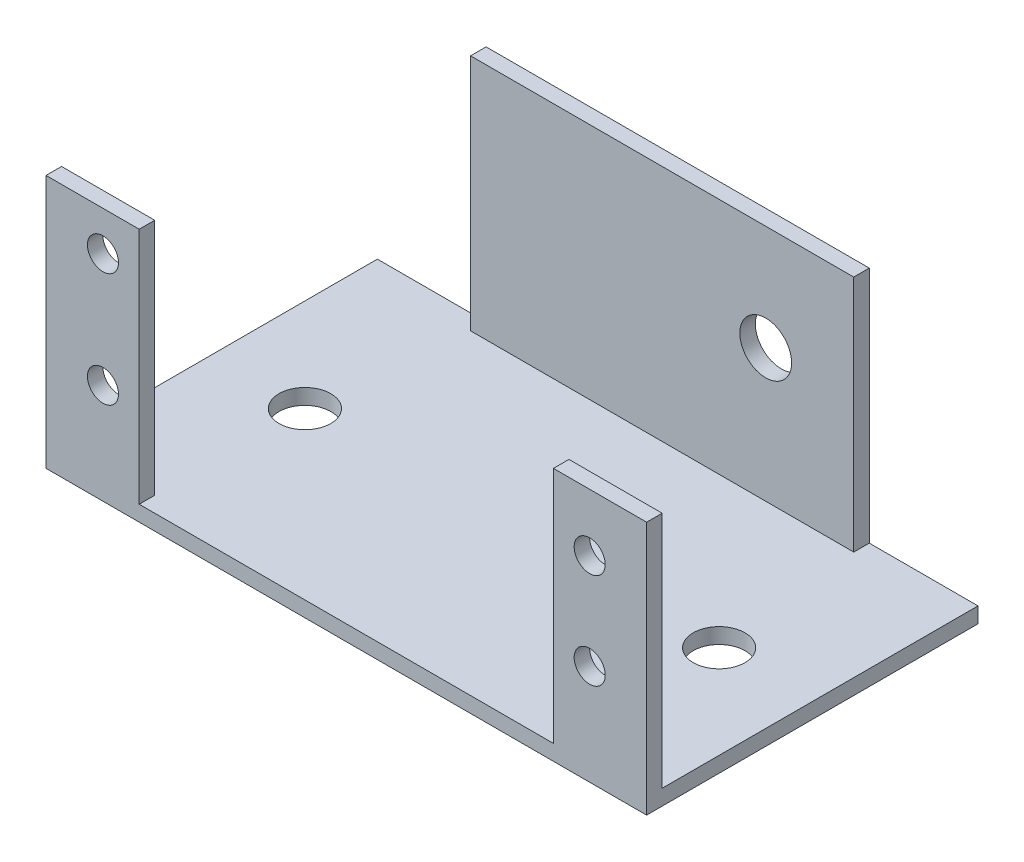
ISO-10303-21;
HEADER;
FILE_DESCRIPTION(('STEP AP214'),'2;1');
FILE_NAME('part.step','',(''),(''),'','','');
FILE_SCHEMA(('AUTOMOTIVE_DESIGN { 1 0 10303 214 1 1 1 1 }'));
ENDSEC;
DATA;
#1=APPLICATION_CONTEXT('core data for automotive mechanical design processes');
#2=APPLICATION_PROTOCOL_DEFINITION('international standard','automotive_design',2000,#1);
#3=PRODUCT_CONTEXT('',#1,'mechanical');
#4=PRODUCT('Part','Part','',(#3));
#5=PRODUCT_RELATED_PRODUCT_CATEGORY('part','',(#4));
#6=PRODUCT_DEFINITION_FORMATION('','',#4);
#7=PRODUCT_DEFINITION_CONTEXT('part definition',#1,'design');
#8=PRODUCT_DEFINITION('design','',#6,#7);
#9=PRODUCT_DEFINITION_SHAPE('','',#8);
#10=(LENGTH_UNIT() NAMED_UNIT(*) SI_UNIT(.MILLI.,.METRE.));
#11=(NAMED_UNIT(*) PLANE_ANGLE_UNIT() SI_UNIT($,.RADIAN.));
#12=(NAMED_UNIT(*) SI_UNIT($,.STERADIAN.) SOLID_ANGLE_UNIT());
#13=UNCERTAINTY_MEASURE_WITH_UNIT(LENGTH_MEASURE(1.E-05),#10,'distance_accuracy_value','');
#14=(GEOMETRIC_REPRESENTATION_CONTEXT(3) GLOBAL_UNCERTAINTY_ASSIGNED_CONTEXT((#13)) GLOBAL_UNIT_ASSIGNED_CONTEXT((#10,
#11,#12)) REPRESENTATION_CONTEXT('',''));
#15=CARTESIAN_POINT('',(0.,0.,0.));
#16=DIRECTION('',(0.,0.,1.));
#17=DIRECTION('',(1.,0.,0.));
#18=AXIS2_PLACEMENT_3D('',#15,#16,#17);
#19=CARTESIAN_POINT('',(0.,0.,0.));
#20=DIRECTION('',(0.,1.,0.));
#21=DIRECTION('',(0.,0.,1.));
#22=AXIS2_PLACEMENT_3D('',#19,#20,#21);
#23=PLANE('',#22);
#24=CARTESIAN_POINT('',(20.,0.,0.));
#25=DIRECTION('',(0.,1.,0.));
#26=DIRECTION('',(0.,0.,1.));
#27=AXIS2_PLACEMENT_3D('',#24,#25,#26);
#28=CIRCLE('',#27,2.5);
#29=CARTESIAN_POINT('',(20.,0.,2.5));
#30=VERTEX_POINT('',#29);
#31=EDGE_CURVE('E303',#30,#30,#28,.T.);
#32=ORIENTED_EDGE('',*,*,#31,.F.);
#33=EDGE_LOOP('',(#32));
#34=FACE_BOUND('',#33,.T.);
#35=CARTESIAN_POINT('',(-20.,0.,0.));
#36=DIRECTION('',(0.,1.,0.));
#37=DIRECTION('',(0.,0.,1.));
#38=AXIS2_PLACEMENT_3D('',#35,#36,#37);
#39=CIRCLE('',#38,2.5);
#40=CARTESIAN_POINT('',(-20.,0.,2.5));
#41=VERTEX_POINT('',#40);
#42=EDGE_CURVE('E309',#41,#41,#39,.T.);
#43=ORIENTED_EDGE('',*,*,#42,.F.);
#44=EDGE_LOOP('',(#43));
#45=FACE_BOUND('',#44,.T.);
#46=DIRECTION('',(-1.,0.,0.));
#47=VECTOR('',#46,1.);
#48=CARTESIAN_POINT('',(0.,0.,-14.5));
#49=LINE('',#48,#47);
#50=CARTESIAN_POINT('',(18.5,0.,-14.5));
#51=VERTEX_POINT('',#50);
#52=CARTESIAN_POINT('',(-18.5,0.,-14.5));
#53=VERTEX_POINT('',#52);
#54=EDGE_CURVE('E88',#51,#53,#49,.T.);
#55=ORIENTED_EDGE('',*,*,#54,.T.);
#56=DIRECTION('',(0.,0.,1.));
#57=VECTOR('',#56,1.);
#58=CARTESIAN_POINT('',(-18.5,0.,0.));
#59=LINE('',#58,#57);
#60=CARTESIAN_POINT('',(-18.5,0.,-16.));
#61=VERTEX_POINT('',#60);
#62=EDGE_CURVE('E319',#61,#53,#59,.T.);
#63=ORIENTED_EDGE('',*,*,#62,.F.);
#64=DIRECTION('',(-1.,0.,0.));
#65=VECTOR('',#64,1.);
#66=CARTESIAN_POINT('',(0.,0.,-16.));
#67=LINE('',#66,#65);
#68=CARTESIAN_POINT('',(-29.,0.,-16.));
#69=VERTEX_POINT('',#68);
#70=EDGE_CURVE('E197',#61,#69,#67,.T.);
#71=ORIENTED_EDGE('',*,*,#70,.T.);
#72=DIRECTION('',(0.,0.,1.));
#73=VECTOR('',#72,1.);
#74=CARTESIAN_POINT('',(-29.,0.,0.));
#75=LINE('',#74,#73);
#76=CARTESIAN_POINT('',(-29.,0.,14.5));
#77=VERTEX_POINT('',#76);
#78=EDGE_CURVE('E285',#69,#77,#75,.T.);
#79=ORIENTED_EDGE('',*,*,#78,.T.);
#80=DIRECTION('',(1.,0.,0.));
#81=VECTOR('',#80,1.);
#82=CARTESIAN_POINT('',(0.,0.,14.5));
#83=LINE('',#82,#81);
#84=CARTESIAN_POINT('',(-20.,0.,14.5));
#85=VERTEX_POINT('',#84);
#86=EDGE_CURVE('E245',#77,#85,#83,.T.);
#87=ORIENTED_EDGE('',*,*,#86,.T.);
#88=DIRECTION('',(0.,0.,1.));
#89=VECTOR('',#88,1.);
#90=CARTESIAN_POINT('',(-20.,0.,0.));
#91=LINE('',#90,#89);
#92=CARTESIAN_POINT('',(-20.,0.,16.));
#93=VERTEX_POINT('',#92);
#94=EDGE_CURVE('E240',#85,#93,#91,.T.);
#95=ORIENTED_EDGE('',*,*,#94,.T.);
#96=DIRECTION('',(-1.,0.,0.));
#97=VECTOR('',#96,1.);
#98=CARTESIAN_POINT('',(0.,0.,16.));
#99=LINE('',#98,#97);
#100=CARTESIAN_POINT('',(20.,0.,16.));
#101=VERTEX_POINT('',#100);
#102=EDGE_CURVE('E271',#101,#93,#99,.T.);
#103=ORIENTED_EDGE('',*,*,#102,.F.);
#104=DIRECTION('',(0.,0.,1.));
#105=VECTOR('',#104,1.);
#106=CARTESIAN_POINT('',(20.,0.,0.));
#107=LINE('',#106,#105);
#108=CARTESIAN_POINT('',(20.,0.,14.5));
#109=VERTEX_POINT('',#108);
#110=EDGE_CURVE('E220',#109,#101,#107,.T.);
#111=ORIENTED_EDGE('',*,*,#110,.F.);
#112=DIRECTION('',(1.,0.,0.));
#113=VECTOR('',#112,1.);
#114=CARTESIAN_POINT('',(0.,0.,14.5));
#115=LINE('',#114,#113);
#116=CARTESIAN_POINT('',(29.,0.,14.5));
#117=VERTEX_POINT('',#116);
#118=EDGE_CURVE('E229',#109,#117,#115,.T.);
#119=ORIENTED_EDGE('',*,*,#118,.T.);
#120=DIRECTION('',(0.,0.,1.));
#121=VECTOR('',#120,1.);
#122=CARTESIAN_POINT('',(29.,0.,0.));
#123=LINE('',#122,#121);
#124=CARTESIAN_POINT('',(29.,0.,-16.));
#125=VERTEX_POINT('',#124);
#126=EDGE_CURVE('E279',#125,#117,#123,.T.);
#127=ORIENTED_EDGE('',*,*,#126,.F.);
#128=CARTESIAN_POINT('',(18.5,0.,-16.));
#129=VERTEX_POINT('',#128);
#130=EDGE_CURVE('E283',#125,#129,#67,.T.);
#131=ORIENTED_EDGE('',*,*,#130,.T.);
#132=DIRECTION('',(0.,0.,1.));
#133=VECTOR('',#132,1.);
#134=CARTESIAN_POINT('',(18.4999999999999,0.,1.28369537222284E-13));
#135=LINE('',#134,#133);
#136=EDGE_CURVE('E93',#129,#51,#135,.T.);
#137=ORIENTED_EDGE('',*,*,#136,.T.);
#138=EDGE_LOOP('',(#55,#63,#71,#79,#87,#95,#103,#111,#119,#127,#131,#137));
#139=FACE_BOUND('',#138,.T.);
#140=ADVANCED_FACE('F71',(#34,#45,#139),#23,.T.);
#141=CARTESIAN_POINT('',(29.,-1.5,0.));
#142=DIRECTION('',(-1.,0.,0.));
#143=DIRECTION('',(0.,0.,1.));
#144=AXIS2_PLACEMENT_3D('',#141,#142,#143);
#145=PLANE('',#144);
#146=ORIENTED_EDGE('',*,*,#126,.T.);
#147=DIRECTION('',(0.,-1.,0.));
#148=VECTOR('',#147,1.);
#149=CARTESIAN_POINT('',(29.,23.,14.5));
#150=LINE('',#149,#148);
#151=CARTESIAN_POINT('',(29.,23.,14.5));
#152=VERTEX_POINT('',#151);
#153=EDGE_CURVE('E228',#152,#117,#150,.T.);
#154=ORIENTED_EDGE('',*,*,#153,.F.);
#155=DIRECTION('',(0.,0.,1.));
#156=VECTOR('',#155,1.);
#157=CARTESIAN_POINT('',(29.,23.,0.));
#158=LINE('',#157,#156);
#159=CARTESIAN_POINT('',(29.,23.,16.));
#160=VERTEX_POINT('',#159);
#161=EDGE_CURVE('E225',#152,#160,#158,.T.);
#162=ORIENTED_EDGE('',*,*,#161,.T.);
#163=DIRECTION('',(0.,1.,0.));
#164=VECTOR('',#163,1.);
#165=CARTESIAN_POINT('',(29.,-1.5,16.));
#166=LINE('',#165,#164);
#167=CARTESIAN_POINT('',(29.,-1.5,16.));
#168=VERTEX_POINT('',#167);
#169=EDGE_CURVE('E266',#168,#160,#166,.T.);
#170=ORIENTED_EDGE('',*,*,#169,.F.);
#171=DIRECTION('',(0.,0.,1.));
#172=VECTOR('',#171,1.);
#173=CARTESIAN_POINT('',(29.,-1.5,0.));
#174=LINE('',#173,#172);
#175=CARTESIAN_POINT('',(29.,-1.5,-16.));
#176=VERTEX_POINT('',#175);
#177=EDGE_CURVE('E267',#176,#168,#174,.T.);
#178=ORIENTED_EDGE('',*,*,#177,.F.);
#179=DIRECTION('',(0.,1.,0.));
#180=VECTOR('',#179,1.);
#181=CARTESIAN_POINT('',(29.,-1.5,-16.));
#182=LINE('',#181,#180);
#183=EDGE_CURVE('E80',#176,#125,#182,.T.);
#184=ORIENTED_EDGE('',*,*,#183,.T.);
#185=EDGE_LOOP('',(#146,#154,#162,#170,#178,#184));
#186=FACE_BOUND('',#185,.T.);
#187=ADVANCED_FACE('F73',(#186),#145,.F.);
#188=CARTESIAN_POINT('',(0.,-1.5,-16.));
#189=DIRECTION('',(0.,0.,-1.));
#190=DIRECTION('',(-1.,0.,0.));
#191=AXIS2_PLACEMENT_3D('',#188,#189,#190);
#192=PLANE('',#191);
#193=CARTESIAN_POINT('',(10.,12.8220392959266,-16.));
#194=DIRECTION('',(0.,0.,1.));
#195=DIRECTION('',(1.,0.,0.));
#196=AXIS2_PLACEMENT_3D('',#193,#194,#195);
#197=CIRCLE('',#196,2.5);
#198=CARTESIAN_POINT('',(12.5,12.8220392959266,-16.));
#199=VERTEX_POINT('',#198);
#200=EDGE_CURVE('E316',#199,#199,#197,.T.);
#201=ORIENTED_EDGE('',*,*,#200,.T.);
#202=EDGE_LOOP('',(#201));
#203=FACE_BOUND('',#202,.T.);
#204=ORIENTED_EDGE('',*,*,#130,.F.);
#205=ORIENTED_EDGE('',*,*,#183,.F.);
#206=DIRECTION('',(-1.,0.,0.));
#207=VECTOR('',#206,1.);
#208=CARTESIAN_POINT('',(0.,-1.5,-16.));
#209=LINE('',#208,#207);
#210=CARTESIAN_POINT('',(-29.,-1.5,-16.));
#211=VERTEX_POINT('',#210);
#212=EDGE_CURVE('E270',#176,#211,#209,.T.);
#213=ORIENTED_EDGE('',*,*,#212,.T.);
#214=DIRECTION('',(0.,1.,0.));
#215=VECTOR('',#214,1.);
#216=CARTESIAN_POINT('',(-29.,-1.5,-16.));
#217=LINE('',#216,#215);
#218=EDGE_CURVE('E12',#211,#69,#217,.T.);
#219=ORIENTED_EDGE('',*,*,#218,.T.);
#220=ORIENTED_EDGE('',*,*,#70,.F.);
#221=DIRECTION('',(0.,-1.,0.));
#222=VECTOR('',#221,1.);
#223=CARTESIAN_POINT('',(-18.5,23.,-16.));
#224=LINE('',#223,#222);
#225=CARTESIAN_POINT('',(-18.5,23.,-16.));
#226=VERTEX_POINT('',#225);
#227=EDGE_CURVE('E179',#226,#61,#224,.T.);
#228=ORIENTED_EDGE('',*,*,#227,.F.);
#229=DIRECTION('',(-1.,0.,0.));
#230=VECTOR('',#229,1.);
#231=CARTESIAN_POINT('',(0.,23.,-16.));
#232=LINE('',#231,#230);
#233=CARTESIAN_POINT('',(18.5,23.,-16.));
#234=VERTEX_POINT('',#233);
#235=EDGE_CURVE('E185',#234,#226,#232,.T.);
#236=ORIENTED_EDGE('',*,*,#235,.F.);
#237=DIRECTION('',(0.,-1.,0.));
#238=VECTOR('',#237,1.);
#239=CARTESIAN_POINT('',(18.5,23.,-16.));
#240=LINE('',#239,#238);
#241=EDGE_CURVE('E324',#234,#129,#240,.T.);
#242=ORIENTED_EDGE('',*,*,#241,.T.);
#243=EDGE_LOOP('',(#204,#205,#213,#219,#220,#228,#236,#242));
#244=FACE_BOUND('',#243,.T.);
#245=ADVANCED_FACE('F196',(#203,#244),#192,.T.);
#246=CARTESIAN_POINT('',(-29.,-1.5,0.));
#247=DIRECTION('',(-1.,0.,0.));
#248=DIRECTION('',(0.,0.,1.));
#249=AXIS2_PLACEMENT_3D('',#246,#247,#248);
#250=PLANE('',#249);
#251=ORIENTED_EDGE('',*,*,#78,.F.);
#252=ORIENTED_EDGE('',*,*,#218,.F.);
#253=DIRECTION('',(0.,0.,1.));
#254=VECTOR('',#253,1.);
#255=CARTESIAN_POINT('',(-29.,-1.5,0.));
#256=LINE('',#255,#254);
#257=CARTESIAN_POINT('',(-29.,-1.5,16.));
#258=VERTEX_POINT('',#257);
#259=EDGE_CURVE('E274',#211,#258,#256,.T.);
#260=ORIENTED_EDGE('',*,*,#259,.T.);
#261=DIRECTION('',(0.,1.,0.));
#262=VECTOR('',#261,1.);
#263=CARTESIAN_POINT('',(-29.,-1.5,16.));
#264=LINE('',#263,#262);
#265=CARTESIAN_POINT('',(-29.,23.,16.));
#266=VERTEX_POINT('',#265);
#267=EDGE_CURVE('E282',#258,#266,#264,.T.);
#268=ORIENTED_EDGE('',*,*,#267,.T.);
#269=DIRECTION('',(0.,0.,1.));
#270=VECTOR('',#269,1.);
#271=CARTESIAN_POINT('',(-29.,23.,0.));
#272=LINE('',#271,#270);
#273=CARTESIAN_POINT('',(-29.,23.,14.5));
#274=VERTEX_POINT('',#273);
#275=EDGE_CURVE('E248',#274,#266,#272,.T.);
#276=ORIENTED_EDGE('',*,*,#275,.F.);
#277=DIRECTION('',(0.,-1.,0.));
#278=VECTOR('',#277,1.);
#279=CARTESIAN_POINT('',(-29.,23.,14.5));
#280=LINE('',#279,#278);
#281=EDGE_CURVE('E261',#274,#77,#280,.T.);
#282=ORIENTED_EDGE('',*,*,#281,.T.);
#283=EDGE_LOOP('',(#251,#252,#260,#268,#276,#282));
#284=FACE_BOUND('',#283,.T.);
#285=ADVANCED_FACE('F336',(#284),#250,.T.);
#286=CARTESIAN_POINT('',(0.,-1.5,16.));
#287=DIRECTION('',(0.,0.,-1.));
#288=DIRECTION('',(-1.,0.,0.));
#289=AXIS2_PLACEMENT_3D('',#286,#287,#288);
#290=PLANE('',#289);
#291=CARTESIAN_POINT('',(-23.5,8.1974878238588,16.));
#292=DIRECTION('',(0.,0.,1.));
#293=DIRECTION('',(1.,0.,0.));
#294=AXIS2_PLACEMENT_3D('',#291,#292,#293);
#295=CIRCLE('',#294,1.5);
#296=CARTESIAN_POINT('',(-22.,8.1974878238588,16.));
#297=VERTEX_POINT('',#296);
#298=EDGE_CURVE('E207',#297,#297,#295,.T.);
#299=ORIENTED_EDGE('',*,*,#298,.F.);
#300=EDGE_LOOP('',(#299));
#301=FACE_BOUND('',#300,.T.);
#302=CARTESIAN_POINT('',(23.5,17.4465907679944,16.));
#303=DIRECTION('',(0.,0.,1.));
#304=DIRECTION('',(1.,0.,0.));
#305=AXIS2_PLACEMENT_3D('',#302,#303,#304);
#306=CIRCLE('',#305,1.5);
#307=CARTESIAN_POINT('',(25.,17.4465907679944,16.));
#308=VERTEX_POINT('',#307);
#309=EDGE_CURVE('E201',#308,#308,#306,.T.);
#310=ORIENTED_EDGE('',*,*,#309,.F.);
#311=EDGE_LOOP('',(#310));
#312=FACE_BOUND('',#311,.T.);
#313=CARTESIAN_POINT('',(23.5,8.1974878238588,16.));
#314=DIRECTION('',(0.,0.,1.));
#315=DIRECTION('',(1.,0.,0.));
#316=AXIS2_PLACEMENT_3D('',#313,#314,#315);
#317=CIRCLE('',#316,1.5);
#318=CARTESIAN_POINT('',(25.,8.1974878238588,16.));
#319=VERTEX_POINT('',#318);
#320=EDGE_CURVE('E198',#319,#319,#317,.T.);
#321=ORIENTED_EDGE('',*,*,#320,.F.);
#322=EDGE_LOOP('',(#321));
#323=FACE_BOUND('',#322,.T.);
#324=CARTESIAN_POINT('',(-23.5,19.1974878238588,16.));
#325=DIRECTION('',(0.,0.,1.));
#326=DIRECTION('',(1.,0.,0.));
#327=AXIS2_PLACEMENT_3D('',#324,#325,#326);
#328=CIRCLE('',#327,1.5);
#329=CARTESIAN_POINT('',(-22.,19.1974878238588,16.));
#330=VERTEX_POINT('',#329);
#331=EDGE_CURVE('E210',#330,#330,#328,.T.);
#332=ORIENTED_EDGE('',*,*,#331,.F.);
#333=EDGE_LOOP('',(#332));
#334=FACE_BOUND('',#333,.T.);
#335=ORIENTED_EDGE('',*,*,#169,.T.);
#336=DIRECTION('',(-1.,0.,0.));
#337=VECTOR('',#336,1.);
#338=CARTESIAN_POINT('',(0.,23.,16.));
#339=LINE('',#338,#337);
#340=CARTESIAN_POINT('',(20.,23.,16.));
#341=VERTEX_POINT('',#340);
#342=EDGE_CURVE('E222',#160,#341,#339,.T.);
#343=ORIENTED_EDGE('',*,*,#342,.T.);
#344=DIRECTION('',(0.,-1.,0.));
#345=VECTOR('',#344,1.);
#346=CARTESIAN_POINT('',(20.,23.,16.));
#347=LINE('',#346,#345);
#348=EDGE_CURVE('E235',#341,#101,#347,.T.);
#349=ORIENTED_EDGE('',*,*,#348,.T.);
#350=ORIENTED_EDGE('',*,*,#102,.T.);
#351=DIRECTION('',(0.,-1.,0.));
#352=VECTOR('',#351,1.);
#353=CARTESIAN_POINT('',(-20.,23.,16.));
#354=LINE('',#353,#352);
#355=CARTESIAN_POINT('',(-20.,23.,16.));
#356=VERTEX_POINT('',#355);
#357=EDGE_CURVE('E254',#356,#93,#354,.T.);
#358=ORIENTED_EDGE('',*,*,#357,.F.);
#359=DIRECTION('',(-1.,0.,0.));
#360=VECTOR('',#359,1.);
#361=CARTESIAN_POINT('',(0.,23.,16.));
#362=LINE('',#361,#360);
#363=EDGE_CURVE('E251',#356,#266,#362,.T.);
#364=ORIENTED_EDGE('',*,*,#363,.T.);
#365=ORIENTED_EDGE('',*,*,#267,.F.);
#366=DIRECTION('',(-1.,0.,0.));
#367=VECTOR('',#366,1.);
#368=CARTESIAN_POINT('',(0.,-1.5,16.));
#369=LINE('',#368,#367);
#370=EDGE_CURVE('E276',#168,#258,#369,.T.);
#371=ORIENTED_EDGE('',*,*,#370,.F.);
#372=EDGE_LOOP('',(#335,#343,#349,#350,#358,#364,#365,#371));
#373=FACE_BOUND('',#372,.T.);
#374=ADVANCED_FACE('F349',(#301,#312,#323,#334,#373),#290,.F.);
#375=CARTESIAN_POINT('',(0.,-1.5,0.));
#376=DIRECTION('',(0.,1.,0.));
#377=DIRECTION('',(0.,0.,1.));
#378=AXIS2_PLACEMENT_3D('',#375,#376,#377);
#379=PLANE('',#378);
#380=CARTESIAN_POINT('',(20.,-1.5,0.));
#381=DIRECTION('',(0.,1.,0.));
#382=DIRECTION('',(0.,0.,1.));
#383=AXIS2_PLACEMENT_3D('',#380,#381,#382);
#384=CIRCLE('',#383,2.5);
#385=CARTESIAN_POINT('',(20.,-1.5,2.5));
#386=VERTEX_POINT('',#385);
#387=EDGE_CURVE('E75',#386,#386,#384,.T.);
#388=ORIENTED_EDGE('',*,*,#387,.T.);
#389=EDGE_LOOP('',(#388));
#390=FACE_BOUND('',#389,.T.);
#391=CARTESIAN_POINT('',(-20.,-1.5,0.));
#392=DIRECTION('',(0.,1.,0.));
#393=DIRECTION('',(0.,0.,1.));
#394=AXIS2_PLACEMENT_3D('',#391,#392,#393);
#395=CIRCLE('',#394,2.5);
#396=CARTESIAN_POINT('',(-20.,-1.5,2.5));
#397=VERTEX_POINT('',#396);
#398=EDGE_CURVE('E301',#397,#397,#395,.T.);
#399=ORIENTED_EDGE('',*,*,#398,.T.);
#400=EDGE_LOOP('',(#399));
#401=FACE_BOUND('',#400,.T.);
#402=ORIENTED_EDGE('',*,*,#177,.T.);
#403=ORIENTED_EDGE('',*,*,#370,.T.);
#404=ORIENTED_EDGE('',*,*,#259,.F.);
#405=ORIENTED_EDGE('',*,*,#212,.F.);
#406=EDGE_LOOP('',(#402,#403,#404,#405));
#407=FACE_BOUND('',#406,.T.);
#408=ADVANCED_FACE('F364',(#390,#401,#407),#379,.F.);
#409=CARTESIAN_POINT('',(-20.,23.,0.));
#410=DIRECTION('',(1.,0.,0.));
#411=DIRECTION('',(0.,0.,-1.));
#412=AXIS2_PLACEMENT_3D('',#409,#410,#411);
#413=PLANE('',#412);
#414=ORIENTED_EDGE('',*,*,#94,.F.);
#415=DIRECTION('',(0.,-1.,0.));
#416=VECTOR('',#415,1.);
#417=CARTESIAN_POINT('',(-20.,23.,14.5));
#418=LINE('',#417,#416);
#419=CARTESIAN_POINT('',(-20.,23.,14.5));
#420=VERTEX_POINT('',#419);
#421=EDGE_CURVE('E263',#420,#85,#418,.T.);
#422=ORIENTED_EDGE('',*,*,#421,.F.);
#423=DIRECTION('',(0.,0.,1.));
#424=VECTOR('',#423,1.);
#425=CARTESIAN_POINT('',(-20.,23.,0.));
#426=LINE('',#425,#424);
#427=EDGE_CURVE('E241',#420,#356,#426,.T.);
#428=ORIENTED_EDGE('',*,*,#427,.T.);
#429=ORIENTED_EDGE('',*,*,#357,.T.);
#430=EDGE_LOOP('',(#414,#422,#428,#429));
#431=FACE_BOUND('',#430,.T.);
#432=ADVANCED_FACE('F345',(#431),#413,.T.);
#433=CARTESIAN_POINT('',(0.,23.,14.5));
#434=DIRECTION('',(0.,0.,-1.));
#435=DIRECTION('',(-1.,0.,0.));
#436=AXIS2_PLACEMENT_3D('',#433,#434,#435);
#437=PLANE('',#436);
#438=CARTESIAN_POINT('',(-23.5,8.1974878238588,14.5));
#439=DIRECTION('',(0.,0.,-1.));
#440=DIRECTION('',(-1.,0.,0.));
#441=AXIS2_PLACEMENT_3D('',#438,#439,#440);
#442=CIRCLE('',#441,1.5);
#443=CARTESIAN_POINT('',(-25.,8.1974878238588,14.5));
#444=VERTEX_POINT('',#443);
#445=EDGE_CURVE('E232',#444,#444,#442,.T.);
#446=ORIENTED_EDGE('',*,*,#445,.F.);
#447=EDGE_LOOP('',(#446));
#448=FACE_BOUND('',#447,.T.);
#449=CARTESIAN_POINT('',(-23.5,19.1974878238588,14.5));
#450=DIRECTION('',(0.,0.,-1.));
#451=DIRECTION('',(-1.,0.,0.));
#452=AXIS2_PLACEMENT_3D('',#449,#450,#451);
#453=CIRCLE('',#452,1.5);
#454=CARTESIAN_POINT('',(-25.,19.1974878238588,14.5));
#455=VERTEX_POINT('',#454);
#456=EDGE_CURVE('E297',#455,#455,#453,.T.);
#457=ORIENTED_EDGE('',*,*,#456,.F.);
#458=EDGE_LOOP('',(#457));
#459=FACE_BOUND('',#458,.T.);
#460=ORIENTED_EDGE('',*,*,#86,.F.);
#461=ORIENTED_EDGE('',*,*,#281,.F.);
#462=DIRECTION('',(1.,0.,0.));
#463=VECTOR('',#462,1.);
#464=CARTESIAN_POINT('',(0.,23.,14.5));
#465=LINE('',#464,#463);
#466=EDGE_CURVE('E244',#274,#420,#465,.T.);
#467=ORIENTED_EDGE('',*,*,#466,.T.);
#468=ORIENTED_EDGE('',*,*,#421,.T.);
#469=EDGE_LOOP('',(#460,#461,#467,#468));
#470=FACE_BOUND('',#469,.T.);
#471=ADVANCED_FACE('F341',(#448,#459,#470),#437,.T.);
#472=CARTESIAN_POINT('',(0.,23.,0.));
#473=DIRECTION('',(0.,1.,0.));
#474=DIRECTION('',(0.,0.,1.));
#475=AXIS2_PLACEMENT_3D('',#472,#473,#474);
#476=PLANE('',#475);
#477=ORIENTED_EDGE('',*,*,#427,.F.);
#478=ORIENTED_EDGE('',*,*,#466,.F.);
#479=ORIENTED_EDGE('',*,*,#275,.T.);
#480=ORIENTED_EDGE('',*,*,#363,.F.);
#481=EDGE_LOOP('',(#477,#478,#479,#480));
#482=FACE_BOUND('',#481,.T.);
#483=ADVANCED_FACE('F366',(#482),#476,.T.);
#484=CARTESIAN_POINT('',(0.,23.,14.5));
#485=DIRECTION('',(0.,0.,-1.));
#486=DIRECTION('',(-1.,0.,0.));
#487=AXIS2_PLACEMENT_3D('',#484,#485,#486);
#488=PLANE('',#487);
#489=CARTESIAN_POINT('',(23.5,17.4465907679944,14.5));
#490=DIRECTION('',(0.,0.,-1.));
#491=DIRECTION('',(-1.,0.,0.));
#492=AXIS2_PLACEMENT_3D('',#489,#490,#491);
#493=CIRCLE('',#492,1.5);
#494=CARTESIAN_POINT('',(22.,17.4465907679944,14.5));
#495=VERTEX_POINT('',#494);
#496=EDGE_CURVE('E294',#495,#495,#493,.T.);
#497=ORIENTED_EDGE('',*,*,#496,.F.);
#498=EDGE_LOOP('',(#497));
#499=FACE_BOUND('',#498,.T.);
#500=CARTESIAN_POINT('',(23.5,8.1974878238588,14.5));
#501=DIRECTION('',(0.,0.,-1.));
#502=DIRECTION('',(-1.,0.,0.));
#503=AXIS2_PLACEMENT_3D('',#500,#501,#502);
#504=CIRCLE('',#503,1.5);
#505=CARTESIAN_POINT('',(22.,8.1974878238588,14.5));
#506=VERTEX_POINT('',#505);
#507=EDGE_CURVE('E215',#506,#506,#504,.T.);
#508=ORIENTED_EDGE('',*,*,#507,.F.);
#509=EDGE_LOOP('',(#508));
#510=FACE_BOUND('',#509,.T.);
#511=ORIENTED_EDGE('',*,*,#118,.F.);
#512=DIRECTION('',(0.,-1.,0.));
#513=VECTOR('',#512,1.);
#514=CARTESIAN_POINT('',(20.,23.,14.5));
#515=LINE('',#514,#513);
#516=CARTESIAN_POINT('',(20.,23.,14.5));
#517=VERTEX_POINT('',#516);
#518=EDGE_CURVE('E238',#517,#109,#515,.T.);
#519=ORIENTED_EDGE('',*,*,#518,.F.);
#520=DIRECTION('',(1.,0.,0.));
#521=VECTOR('',#520,1.);
#522=CARTESIAN_POINT('',(0.,23.,14.5));
#523=LINE('',#522,#521);
#524=EDGE_CURVE('E216',#517,#152,#523,.T.);
#525=ORIENTED_EDGE('',*,*,#524,.T.);
#526=ORIENTED_EDGE('',*,*,#153,.T.);
#527=EDGE_LOOP('',(#511,#519,#525,#526));
#528=FACE_BOUND('',#527,.T.);
#529=ADVANCED_FACE('F368',(#499,#510,#528),#488,.T.);
#530=CARTESIAN_POINT('',(20.,23.,0.));
#531=DIRECTION('',(1.,0.,0.));
#532=DIRECTION('',(0.,0.,-1.));
#533=AXIS2_PLACEMENT_3D('',#530,#531,#532);
#534=PLANE('',#533);
#535=ORIENTED_EDGE('',*,*,#110,.T.);
#536=ORIENTED_EDGE('',*,*,#348,.F.);
#537=DIRECTION('',(0.,0.,1.));
#538=VECTOR('',#537,1.);
#539=CARTESIAN_POINT('',(20.,23.,0.));
#540=LINE('',#539,#538);
#541=EDGE_CURVE('E219',#517,#341,#540,.T.);
#542=ORIENTED_EDGE('',*,*,#541,.F.);
#543=ORIENTED_EDGE('',*,*,#518,.T.);
#544=EDGE_LOOP('',(#535,#536,#542,#543));
#545=FACE_BOUND('',#544,.T.);
#546=ADVANCED_FACE('F355',(#545),#534,.F.);
#547=CARTESIAN_POINT('',(0.,23.,0.));
#548=DIRECTION('',(0.,1.,0.));
#549=DIRECTION('',(0.,0.,1.));
#550=AXIS2_PLACEMENT_3D('',#547,#548,#549);
#551=PLANE('',#550);
#552=ORIENTED_EDGE('',*,*,#524,.F.);
#553=ORIENTED_EDGE('',*,*,#541,.T.);
#554=ORIENTED_EDGE('',*,*,#342,.F.);
#555=ORIENTED_EDGE('',*,*,#161,.F.);
#556=EDGE_LOOP('',(#552,#553,#554,#555));
#557=FACE_BOUND('',#556,.T.);
#558=ADVANCED_FACE('F420',(#557),#551,.T.);
#559=CARTESIAN_POINT('',(23.5,8.1974878238588,-16.));
#560=DIRECTION('',(0.,0.,1.));
#561=DIRECTION('',(1.,0.,0.));
#562=AXIS2_PLACEMENT_3D('',#559,#560,#561);
#563=CYLINDRICAL_SURFACE('',#562,1.5);
#564=ORIENTED_EDGE('',*,*,#507,.T.);
#565=EDGE_LOOP('',(#564));
#566=FACE_BOUND('',#565,.T.);
#567=ORIENTED_EDGE('',*,*,#320,.T.);
#568=EDGE_LOOP('',(#567));
#569=FACE_BOUND('',#568,.T.);
#570=ADVANCED_FACE('F416',(#566,#569),#563,.F.);
#571=CARTESIAN_POINT('',(23.5,17.4465907679944,-16.));
#572=DIRECTION('',(0.,0.,1.));
#573=DIRECTION('',(1.,0.,0.));
#574=AXIS2_PLACEMENT_3D('',#571,#572,#573);
#575=CYLINDRICAL_SURFACE('',#574,1.5);
#576=ORIENTED_EDGE('',*,*,#496,.T.);
#577=EDGE_LOOP('',(#576));
#578=FACE_BOUND('',#577,.T.);
#579=ORIENTED_EDGE('',*,*,#309,.T.);
#580=EDGE_LOOP('',(#579));
#581=FACE_BOUND('',#580,.T.);
#582=ADVANCED_FACE('F419',(#578,#581),#575,.F.);
#583=CARTESIAN_POINT('',(-23.5,19.1974878238588,-16.));
#584=DIRECTION('',(0.,0.,1.));
#585=DIRECTION('',(1.,0.,0.));
#586=AXIS2_PLACEMENT_3D('',#583,#584,#585);
#587=CYLINDRICAL_SURFACE('',#586,1.5);
#588=ORIENTED_EDGE('',*,*,#456,.T.);
#589=EDGE_LOOP('',(#588));
#590=FACE_BOUND('',#589,.T.);
#591=ORIENTED_EDGE('',*,*,#331,.T.);
#592=EDGE_LOOP('',(#591));
#593=FACE_BOUND('',#592,.T.);
#594=ADVANCED_FACE('F424',(#590,#593),#587,.F.);
#595=CARTESIAN_POINT('',(-23.5,8.1974878238588,-16.));
#596=DIRECTION('',(0.,0.,1.));
#597=DIRECTION('',(1.,0.,0.));
#598=AXIS2_PLACEMENT_3D('',#595,#596,#597);
#599=CYLINDRICAL_SURFACE('',#598,1.5);
#600=ORIENTED_EDGE('',*,*,#445,.T.);
#601=EDGE_LOOP('',(#600));
#602=FACE_BOUND('',#601,.T.);
#603=ORIENTED_EDGE('',*,*,#298,.T.);
#604=EDGE_LOOP('',(#603));
#605=FACE_BOUND('',#604,.T.);
#606=ADVANCED_FACE('F412',(#602,#605),#599,.F.);
#607=CARTESIAN_POINT('',(-18.5,23.,0.));
#608=DIRECTION('',(1.,0.,0.));
#609=DIRECTION('',(0.,0.,-1.));
#610=AXIS2_PLACEMENT_3D('',#607,#608,#609);
#611=PLANE('',#610);
#612=ORIENTED_EDGE('',*,*,#62,.T.);
#613=DIRECTION('',(0.,-1.,0.));
#614=VECTOR('',#613,1.);
#615=CARTESIAN_POINT('',(-18.5,23.,-14.5));
#616=LINE('',#615,#614);
#617=CARTESIAN_POINT('',(-18.5,23.,-14.5));
#618=VERTEX_POINT('',#617);
#619=EDGE_CURVE('E180',#618,#53,#616,.T.);
#620=ORIENTED_EDGE('',*,*,#619,.F.);
#621=DIRECTION('',(0.,0.,1.));
#622=VECTOR('',#621,1.);
#623=CARTESIAN_POINT('',(-18.5,23.,0.));
#624=LINE('',#623,#622);
#625=EDGE_CURVE('E174',#226,#618,#624,.T.);
#626=ORIENTED_EDGE('',*,*,#625,.F.);
#627=ORIENTED_EDGE('',*,*,#227,.T.);
#628=EDGE_LOOP('',(#612,#620,#626,#627));
#629=FACE_BOUND('',#628,.T.);
#630=ADVANCED_FACE('F177',(#629),#611,.F.);
#631=CARTESIAN_POINT('',(0.,23.,-14.5));
#632=DIRECTION('',(0.,0.,1.));
#633=DIRECTION('',(1.,0.,0.));
#634=AXIS2_PLACEMENT_3D('',#631,#632,#633);
#635=PLANE('',#634);
#636=CARTESIAN_POINT('',(10.,12.8220392959266,-14.5));
#637=DIRECTION('',(0.,0.,1.));
#638=DIRECTION('',(1.,0.,0.));
#639=AXIS2_PLACEMENT_3D('',#636,#637,#638);
#640=CIRCLE('',#639,2.5);
#641=CARTESIAN_POINT('',(12.5,12.8220392959266,-14.5));
#642=VERTEX_POINT('',#641);
#643=EDGE_CURVE('E307',#642,#642,#640,.T.);
#644=ORIENTED_EDGE('',*,*,#643,.F.);
#645=EDGE_LOOP('',(#644));
#646=FACE_BOUND('',#645,.T.);
#647=ORIENTED_EDGE('',*,*,#54,.F.);
#648=DIRECTION('',(0.,-1.,0.));
#649=VECTOR('',#648,1.);
#650=CARTESIAN_POINT('',(18.5,23.,-14.5));
#651=LINE('',#650,#649);
#652=CARTESIAN_POINT('',(18.5,23.,-14.5));
#653=VERTEX_POINT('',#652);
#654=EDGE_CURVE('E203',#653,#51,#651,.T.);
#655=ORIENTED_EDGE('',*,*,#654,.F.);
#656=DIRECTION('',(-1.,0.,0.));
#657=VECTOR('',#656,1.);
#658=CARTESIAN_POINT('',(0.,23.,-14.5));
#659=LINE('',#658,#657);
#660=EDGE_CURVE('E184',#653,#618,#659,.T.);
#661=ORIENTED_EDGE('',*,*,#660,.T.);
#662=ORIENTED_EDGE('',*,*,#619,.T.);
#663=EDGE_LOOP('',(#647,#655,#661,#662));
#664=FACE_BOUND('',#663,.T.);
#665=ADVANCED_FACE('F331',(#646,#664),#635,.T.);
#666=CARTESIAN_POINT('',(18.4999999999999,23.,1.28369537222284E-13));
#667=DIRECTION('',(1.,0.,0.));
#668=DIRECTION('',(0.,0.,-1.));
#669=AXIS2_PLACEMENT_3D('',#666,#667,#668);
#670=PLANE('',#669);
#671=ORIENTED_EDGE('',*,*,#136,.F.);
#672=ORIENTED_EDGE('',*,*,#241,.F.);
#673=DIRECTION('',(0.,0.,1.));
#674=VECTOR('',#673,1.);
#675=CARTESIAN_POINT('',(18.4999999999999,23.,1.28369537222284E-13));
#676=LINE('',#675,#674);
#677=EDGE_CURVE('E191',#234,#653,#676,.T.);
#678=ORIENTED_EDGE('',*,*,#677,.T.);
#679=ORIENTED_EDGE('',*,*,#654,.T.);
#680=EDGE_LOOP('',(#671,#672,#678,#679));
#681=FACE_BOUND('',#680,.T.);
#682=ADVANCED_FACE('F329',(#681),#670,.T.);
#683=CARTESIAN_POINT('',(0.,23.,0.));
#684=DIRECTION('',(0.,1.,0.));
#685=DIRECTION('',(0.,0.,1.));
#686=AXIS2_PLACEMENT_3D('',#683,#684,#685);
#687=PLANE('',#686);
#688=ORIENTED_EDGE('',*,*,#235,.T.);
#689=ORIENTED_EDGE('',*,*,#625,.T.);
#690=ORIENTED_EDGE('',*,*,#660,.F.);
#691=ORIENTED_EDGE('',*,*,#677,.F.);
#692=EDGE_LOOP('',(#688,#689,#690,#691));
#693=FACE_BOUND('',#692,.T.);
#694=ADVANCED_FACE('F189',(#693),#687,.T.);
#695=CARTESIAN_POINT('',(10.,12.8220392959266,-16.));
#696=DIRECTION('',(0.,0.,1.));
#697=DIRECTION('',(1.,0.,0.));
#698=AXIS2_PLACEMENT_3D('',#695,#696,#697);
#699=CYLINDRICAL_SURFACE('',#698,2.5);
#700=CARTESIAN_POINT('',(12.5,12.8220392959266,-16.));
#701=CARTESIAN_POINT('',(12.5,12.8220392959266,-15.984375));
#702=CARTESIAN_POINT('',(12.5,12.8220392959266,-15.96875));
#703=CARTESIAN_POINT('',(12.5,12.8220392959266,-15.9375));
#704=CARTESIAN_POINT('',(12.5,12.8220392959266,-15.921875));
#705=CARTESIAN_POINT('',(12.5,12.8220392959266,-15.890625));
#706=CARTESIAN_POINT('',(12.5,12.8220392959266,-15.875));
#707=CARTESIAN_POINT('',(12.5,12.8220392959266,-15.84375));
#708=CARTESIAN_POINT('',(12.5,12.8220392959266,-15.828125));
#709=CARTESIAN_POINT('',(12.5,12.8220392959266,-15.796875));
#710=CARTESIAN_POINT('',(12.5,12.8220392959266,-15.78125));
#711=CARTESIAN_POINT('',(12.5,12.8220392959266,-15.75));
#712=CARTESIAN_POINT('',(12.5,12.8220392959266,-15.734375));
#713=CARTESIAN_POINT('',(12.5,12.8220392959266,-15.703125));
#714=CARTESIAN_POINT('',(12.5,12.8220392959266,-15.6875));
#715=CARTESIAN_POINT('',(12.5,12.8220392959266,-15.65625));
#716=CARTESIAN_POINT('',(12.5,12.8220392959266,-15.640625));
#717=CARTESIAN_POINT('',(12.5,12.8220392959266,-15.609375));
#718=CARTESIAN_POINT('',(12.5,12.8220392959266,-15.59375));
#719=CARTESIAN_POINT('',(12.5,12.8220392959266,-15.5625));
#720=CARTESIAN_POINT('',(12.5,12.8220392959266,-15.546875));
#721=CARTESIAN_POINT('',(12.5,12.8220392959266,-15.515625));
#722=CARTESIAN_POINT('',(12.5,12.8220392959266,-15.5));
#723=CARTESIAN_POINT('',(12.5,12.8220392959266,-15.46875));
#724=CARTESIAN_POINT('',(12.5,12.8220392959266,-15.453125));
#725=CARTESIAN_POINT('',(12.5,12.8220392959266,-15.421875));
#726=CARTESIAN_POINT('',(12.5,12.8220392959266,-15.40625));
#727=CARTESIAN_POINT('',(12.5,12.8220392959266,-15.375));
#728=CARTESIAN_POINT('',(12.5,12.8220392959266,-15.359375));
#729=CARTESIAN_POINT('',(12.5,12.8220392959266,-15.328125));
#730=CARTESIAN_POINT('',(12.5,12.8220392959266,-15.3125));
#731=CARTESIAN_POINT('',(12.5,12.8220392959266,-15.28125));
#732=CARTESIAN_POINT('',(12.5,12.8220392959266,-15.265625));
#733=CARTESIAN_POINT('',(12.5,12.8220392959266,-15.234375));
#734=CARTESIAN_POINT('',(12.5,12.8220392959266,-15.21875));
#735=CARTESIAN_POINT('',(12.5,12.8220392959266,-15.1875));
#736=CARTESIAN_POINT('',(12.5,12.8220392959266,-15.171875));
#737=CARTESIAN_POINT('',(12.5,12.8220392959266,-15.140625));
#738=CARTESIAN_POINT('',(12.5,12.8220392959266,-15.125));
#739=CARTESIAN_POINT('',(12.5,12.8220392959266,-15.09375));
#740=CARTESIAN_POINT('',(12.5,12.8220392959266,-15.078125));
#741=CARTESIAN_POINT('',(12.5,12.8220392959266,-15.046875));
#742=CARTESIAN_POINT('',(12.5,12.8220392959266,-15.03125));
#743=CARTESIAN_POINT('',(12.5,12.8220392959266,-15.));
#744=CARTESIAN_POINT('',(12.5,12.8220392959266,-14.984375));
#745=CARTESIAN_POINT('',(12.5,12.8220392959266,-14.953125));
#746=CARTESIAN_POINT('',(12.5,12.8220392959266,-14.9375));
#747=CARTESIAN_POINT('',(12.5,12.8220392959266,-14.90625));
#748=CARTESIAN_POINT('',(12.5,12.8220392959266,-14.890625));
#749=CARTESIAN_POINT('',(12.5,12.8220392959266,-14.859375));
#750=CARTESIAN_POINT('',(12.5,12.8220392959266,-14.84375));
#751=CARTESIAN_POINT('',(12.5,12.8220392959266,-14.8125));
#752=CARTESIAN_POINT('',(12.5,12.8220392959266,-14.796875));
#753=CARTESIAN_POINT('',(12.5,12.8220392959266,-14.765625));
#754=CARTESIAN_POINT('',(12.5,12.8220392959266,-14.75));
#755=CARTESIAN_POINT('',(12.5,12.8220392959266,-14.71875));
#756=CARTESIAN_POINT('',(12.5,12.8220392959266,-14.703125));
#757=CARTESIAN_POINT('',(12.5,12.8220392959266,-14.671875));
#758=CARTESIAN_POINT('',(12.5,12.8220392959266,-14.65625));
#759=CARTESIAN_POINT('',(12.5,12.8220392959266,-14.625));
#760=CARTESIAN_POINT('',(12.5,12.8220392959266,-14.609375));
#761=CARTESIAN_POINT('',(12.5,12.8220392959266,-14.578125));
#762=CARTESIAN_POINT('',(12.5,12.8220392959266,-14.5625));
#763=CARTESIAN_POINT('',(12.5,12.8220392959266,-14.53125));
#764=CARTESIAN_POINT('',(12.5,12.8220392959266,-14.515625));
#765=CARTESIAN_POINT('',(12.5,12.8220392959266,-14.5));
#766=B_SPLINE_CURVE_WITH_KNOTS('',3,(#700,#701,#702,#703,#704,#705,#706,#707,#708,#709,#710,
#711,#712,#713,#714,#715,#716,#717,#718,#719,#720,#721,#722,#723,#724,#725,#726,#727,#728,#729,
#730,#731,#732,#733,#734,#735,#736,#737,#738,#739,#740,#741,#742,#743,#744,#745,#746,#747,#748,
#749,#750,#751,#752,#753,#754,#755,#756,#757,#758,#759,#760,#761,#762,#763,#764,#765),
.UNSPECIFIED.,.F.,.F.,(4,2,2,2,2,2,2,2,2,2,2,2,2,2,2,2,2,2,2,2,2,2,2,2,2,2,2,2,2,2,2,2,4),(0.,
0.0468749999999983,0.0937500000000001,0.140624999999998,0.1875,0.234374999999998,0.28125,
0.328124999999999,0.375,0.421874999999999,0.46875,0.515625,0.5625,0.609375000000001,
0.656250000000001,0.703125000000001,0.750000000000001,0.796875000000001,0.843750000000001,
0.890625000000001,0.937500000000001,0.984375000000001,1.03125,1.078125,1.125,1.171875,1.21875,
1.265625,1.3125,1.359375,1.40625,1.453125,1.5),.UNSPECIFIED.);
#767=EDGE_CURVE('BSEAM398',#199,#642,#766,.T.);
#768=ORIENTED_EDGE('',*,*,#200,.F.);
#769=ORIENTED_EDGE('',*,*,#643,.T.);
#770=ORIENTED_EDGE('',*,*,#767,.T.);
#771=ORIENTED_EDGE('',*,*,#767,.F.);
#772=EDGE_LOOP('',(#768,#770,#769,#771));
#773=FACE_BOUND('',#772,.T.);
#774=ADVANCED_FACE('F398',(#773),#699,.F.);
#775=CARTESIAN_POINT('',(-20.,-25.,0.));
#776=DIRECTION('',(0.,1.,0.));
#777=DIRECTION('',(0.,0.,1.));
#778=AXIS2_PLACEMENT_3D('',#775,#776,#777);
#779=CYLINDRICAL_SURFACE('',#778,2.5);
#780=ORIENTED_EDGE('',*,*,#42,.T.);
#781=EDGE_LOOP('',(#780));
#782=FACE_BOUND('',#781,.T.);
#783=ORIENTED_EDGE('',*,*,#398,.F.);
#784=EDGE_LOOP('',(#783));
#785=FACE_BOUND('',#784,.T.);
#786=ADVANCED_FACE('F401',(#782,#785),#779,.F.);
#787=CARTESIAN_POINT('',(20.,-25.,0.));
#788=DIRECTION('',(0.,1.,0.));
#789=DIRECTION('',(0.,0.,1.));
#790=AXIS2_PLACEMENT_3D('',#787,#788,#789);
#791=CYLINDRICAL_SURFACE('',#790,2.5);
#792=ORIENTED_EDGE('',*,*,#31,.T.);
#793=EDGE_LOOP('',(#792));
#794=FACE_BOUND('',#793,.T.);
#795=ORIENTED_EDGE('',*,*,#387,.F.);
#796=EDGE_LOOP('',(#795));
#797=FACE_BOUND('',#796,.T.);
#798=ADVANCED_FACE('F518',(#794,#797),#791,.F.);
#799=CLOSED_SHELL('',(#140,#187,#245,#285,#374,#408,#432,#471,#483,#529,#546,#558,#570,#582,
#594,#606,#630,#665,#682,#694,#774,#786,#798));
#800=MANIFOLD_SOLID_BREP('B2',#799);
#801=ADVANCED_BREP_SHAPE_REPRESENTATION('',(#18,#800),#14);
#802=SHAPE_DEFINITION_REPRESENTATION(#9,#801);
ENDSEC;
END-ISO-10303-21;
